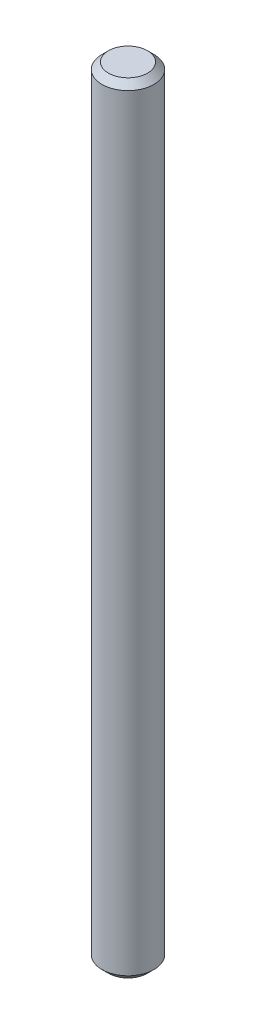
ISO-10303-21;
HEADER;
FILE_DESCRIPTION(('STEP AP214'),'2;1');
FILE_NAME('part.step','',(''),(''),'','','');
FILE_SCHEMA(('AUTOMOTIVE_DESIGN { 1 0 10303 214 1 1 1 1 }'));
ENDSEC;
DATA;
#1=APPLICATION_CONTEXT('core data for automotive mechanical design processes');
#2=APPLICATION_PROTOCOL_DEFINITION('international standard','automotive_design',2000,#1);
#3=PRODUCT_CONTEXT('',#1,'mechanical');
#4=PRODUCT('Part','Part','',(#3));
#5=PRODUCT_RELATED_PRODUCT_CATEGORY('part','',(#4));
#6=PRODUCT_DEFINITION_FORMATION('','',#4);
#7=PRODUCT_DEFINITION_CONTEXT('part definition',#1,'design');
#8=PRODUCT_DEFINITION('design','',#6,#7);
#9=PRODUCT_DEFINITION_SHAPE('','',#8);
#10=(LENGTH_UNIT() NAMED_UNIT(*) SI_UNIT(.MILLI.,.METRE.));
#11=(NAMED_UNIT(*) PLANE_ANGLE_UNIT() SI_UNIT($,.RADIAN.));
#12=(NAMED_UNIT(*) SI_UNIT($,.STERADIAN.) SOLID_ANGLE_UNIT());
#13=UNCERTAINTY_MEASURE_WITH_UNIT(LENGTH_MEASURE(1.E-05),#10,'distance_accuracy_value','');
#14=(GEOMETRIC_REPRESENTATION_CONTEXT(3) GLOBAL_UNCERTAINTY_ASSIGNED_CONTEXT((#13)) GLOBAL_UNIT_ASSIGNED_CONTEXT((#10,
#11,#12)) REPRESENTATION_CONTEXT('',''));
#15=CARTESIAN_POINT('',(0.,0.,0.));
#16=DIRECTION('',(0.,0.,1.));
#17=DIRECTION('',(1.,0.,0.));
#18=AXIS2_PLACEMENT_3D('',#15,#16,#17);
#19=CARTESIAN_POINT('',(0.,120.,0.));
#20=DIRECTION('',(0.,-1.,0.));
#21=DIRECTION('',(0.,0.,-1.));
#22=AXIS2_PLACEMENT_3D('',#19,#20,#21);
#23=CYLINDRICAL_SURFACE('',#22,4.);
#24=CARTESIAN_POINT('',(0.,1.,0.));
#25=DIRECTION('',(0.,1.,0.));
#26=DIRECTION('',(0.,0.,1.));
#27=AXIS2_PLACEMENT_3D('',#24,#25,#26);
#28=CIRCLE('',#27,4.);
#29=CARTESIAN_POINT('',(0.,1.,4.));
#30=VERTEX_POINT('',#29);
#31=EDGE_CURVE('E45',#30,#30,#28,.T.);
#32=ORIENTED_EDGE('',*,*,#31,.T.);
#33=EDGE_LOOP('',(#32));
#34=FACE_BOUND('',#33,.T.);
#35=CARTESIAN_POINT('',(0.,119.,0.));
#36=DIRECTION('',(0.,1.,0.));
#37=DIRECTION('',(0.,0.,1.));
#38=AXIS2_PLACEMENT_3D('',#35,#36,#37);
#39=CIRCLE('',#38,4.);
#40=CARTESIAN_POINT('',(0.,119.,4.));
#41=VERTEX_POINT('',#40);
#42=EDGE_CURVE('E49',#41,#41,#39,.F.);
#43=ORIENTED_EDGE('',*,*,#42,.T.);
#44=EDGE_LOOP('',(#43));
#45=FACE_BOUND('',#44,.T.);
#46=ADVANCED_FACE('F34',(#34,#45),#23,.T.);
#47=CARTESIAN_POINT('',(0.,120.,0.));
#48=DIRECTION('',(0.,1.,0.));
#49=DIRECTION('',(0.,0.,1.));
#50=AXIS2_PLACEMENT_3D('',#47,#48,#49);
#51=PLANE('',#50);
#52=CARTESIAN_POINT('',(0.,120.,0.));
#53=DIRECTION('',(0.,1.,0.));
#54=DIRECTION('',(0.,0.,1.));
#55=AXIS2_PLACEMENT_3D('',#52,#53,#54);
#56=CIRCLE('',#55,3.00000000000002);
#57=CARTESIAN_POINT('',(0.,120.,3.00000000000002));
#58=VERTEX_POINT('',#57);
#59=EDGE_CURVE('E10',#58,#58,#56,.T.);
#60=ORIENTED_EDGE('',*,*,#59,.T.);
#61=EDGE_LOOP('',(#60));
#62=FACE_BOUND('',#61,.T.);
#63=ADVANCED_FACE('F65',(#62),#51,.T.);
#64=CARTESIAN_POINT('',(0.,0.,0.));
#65=DIRECTION('',(0.,1.,0.));
#66=DIRECTION('',(0.,0.,1.));
#67=AXIS2_PLACEMENT_3D('',#64,#65,#66);
#68=PLANE('',#67);
#69=CARTESIAN_POINT('',(0.,0.,0.));
#70=DIRECTION('',(0.,1.,0.));
#71=DIRECTION('',(0.,0.,1.));
#72=AXIS2_PLACEMENT_3D('',#69,#70,#71);
#73=CIRCLE('',#72,3.);
#74=CARTESIAN_POINT('',(0.,0.,3.));
#75=VERTEX_POINT('',#74);
#76=EDGE_CURVE('E41',#75,#75,#73,.F.);
#77=ORIENTED_EDGE('',*,*,#76,.T.);
#78=EDGE_LOOP('',(#77));
#79=FACE_BOUND('',#78,.T.);
#80=ADVANCED_FACE('F62',(#79),#68,.F.);
#81=CARTESIAN_POINT('',(0.,1.,0.));
#82=DIRECTION('',(0.,1.,0.));
#83=DIRECTION('',(0.,0.,1.));
#84=AXIS2_PLACEMENT_3D('',#81,#82,#83);
#85=CONICAL_SURFACE('',#84,4.,0.785398163397447);
#86=ORIENTED_EDGE('',*,*,#76,.F.);
#87=EDGE_LOOP('',(#86));
#88=FACE_BOUND('',#87,.T.);
#89=ORIENTED_EDGE('',*,*,#31,.F.);
#90=EDGE_LOOP('',(#89));
#91=FACE_BOUND('',#90,.T.);
#92=ADVANCED_FACE('F58',(#88,#91),#85,.T.);
#93=CARTESIAN_POINT('',(0.,120.,0.));
#94=DIRECTION('',(0.,-1.,0.));
#95=DIRECTION('',(0.,0.,-1.));
#96=AXIS2_PLACEMENT_3D('',#93,#94,#95);
#97=CONICAL_SURFACE('',#96,3.00000000000002,0.785398163397447);
#98=ORIENTED_EDGE('',*,*,#42,.F.);
#99=EDGE_LOOP('',(#98));
#100=FACE_BOUND('',#99,.T.);
#101=ORIENTED_EDGE('',*,*,#59,.F.);
#102=EDGE_LOOP('',(#101));
#103=FACE_BOUND('',#102,.T.);
#104=ADVANCED_FACE('F36',(#100,#103),#97,.T.);
#105=CLOSED_SHELL('',(#46,#63,#80,#92,#104));
#106=MANIFOLD_SOLID_BREP('B2',#105);
#107=ADVANCED_BREP_SHAPE_REPRESENTATION('',(#18,#106),#14);
#108=SHAPE_DEFINITION_REPRESENTATION(#9,#107);
ENDSEC;
END-ISO-10303-21;
